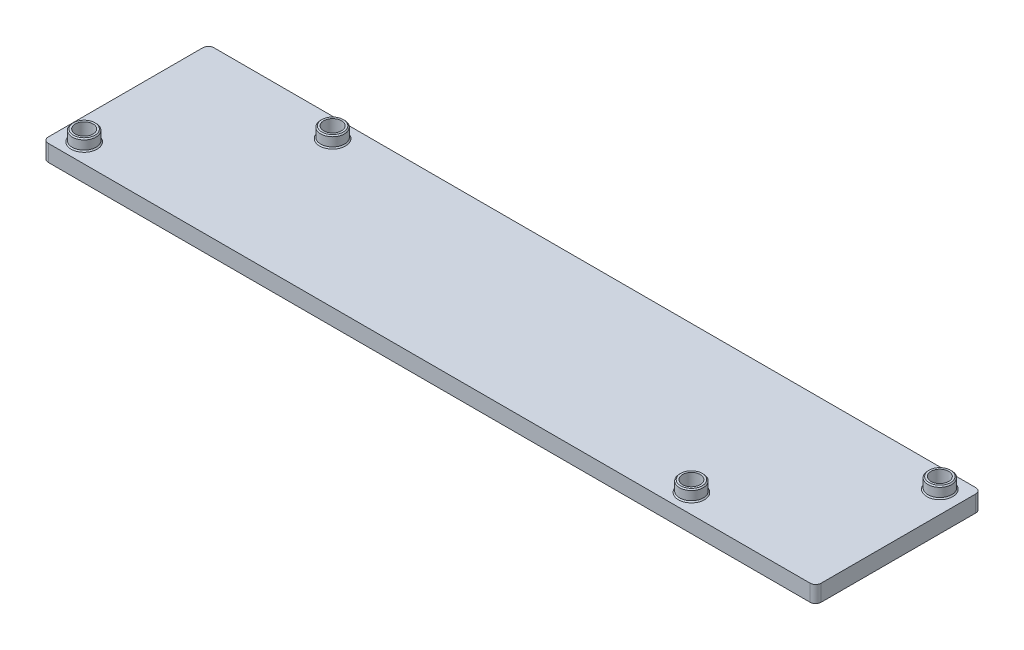
ISO-10303-21;
HEADER;
FILE_DESCRIPTION(('STEP AP214'),'2;1');
FILE_NAME('part.step','',(''),(''),'','','');
FILE_SCHEMA(('AUTOMOTIVE_DESIGN { 1 0 10303 214 1 1 1 1 }'));
ENDSEC;
DATA;
#1=APPLICATION_CONTEXT('core data for automotive mechanical design processes');
#2=APPLICATION_PROTOCOL_DEFINITION('international standard','automotive_design',2000,#1);
#3=PRODUCT_CONTEXT('',#1,'mechanical');
#4=PRODUCT('Part','Part','',(#3));
#5=PRODUCT_RELATED_PRODUCT_CATEGORY('part','',(#4));
#6=PRODUCT_DEFINITION_FORMATION('','',#4);
#7=PRODUCT_DEFINITION_CONTEXT('part definition',#1,'design');
#8=PRODUCT_DEFINITION('design','',#6,#7);
#9=PRODUCT_DEFINITION_SHAPE('','',#8);
#10=(LENGTH_UNIT() NAMED_UNIT(*) SI_UNIT(.MILLI.,.METRE.));
#11=(NAMED_UNIT(*) PLANE_ANGLE_UNIT() SI_UNIT($,.RADIAN.));
#12=(NAMED_UNIT(*) SI_UNIT($,.STERADIAN.) SOLID_ANGLE_UNIT());
#13=UNCERTAINTY_MEASURE_WITH_UNIT(LENGTH_MEASURE(1.E-05),#10,'distance_accuracy_value','');
#14=(GEOMETRIC_REPRESENTATION_CONTEXT(3) GLOBAL_UNCERTAINTY_ASSIGNED_CONTEXT((#13)) GLOBAL_UNIT_ASSIGNED_CONTEXT((#10,
#11,#12)) REPRESENTATION_CONTEXT('',''));
#15=CARTESIAN_POINT('',(0.,0.,0.));
#16=DIRECTION('',(0.,0.,1.));
#17=DIRECTION('',(1.,0.,0.));
#18=AXIS2_PLACEMENT_3D('',#15,#16,#17);
#19=CARTESIAN_POINT('',(0.,3.,0.));
#20=DIRECTION('',(0.,1.,0.));
#21=DIRECTION('',(0.,0.,1.));
#22=AXIS2_PLACEMENT_3D('',#19,#20,#21);
#23=PLANE('',#22);
#24=CARTESIAN_POINT('',(136.,3.,-26.5));
#25=DIRECTION('',(0.,1.,0.));
#26=DIRECTION('',(0.,0.,1.));
#27=AXIS2_PLACEMENT_3D('',#24,#25,#26);
#28=CIRCLE('',#27,2.34999999999999);
#29=CARTESIAN_POINT('',(136.,3.,-24.15));
#30=VERTEX_POINT('',#29);
#31=EDGE_CURVE('E153',#30,#30,#28,.F.);
#32=ORIENTED_EDGE('',*,*,#31,.T.);
#33=EDGE_LOOP('',(#32));
#34=FACE_BOUND('',#33,.T.);
#35=CARTESIAN_POINT('',(114.,3.,-3.50000000000001));
#36=DIRECTION('',(0.,1.,0.));
#37=DIRECTION('',(0.,0.,1.));
#38=AXIS2_PLACEMENT_3D('',#35,#36,#37);
#39=CIRCLE('',#38,2.34999999999999);
#40=CARTESIAN_POINT('',(114.,3.,-5.85));
#41=VERTEX_POINT('',#40);
#42=EDGE_CURVE('E150',#41,#41,#39,.F.);
#43=ORIENTED_EDGE('',*,*,#42,.T.);
#44=EDGE_LOOP('',(#43));
#45=FACE_BOUND('',#44,.T.);
#46=CARTESIAN_POINT('',(26.,3.,-26.5));
#47=DIRECTION('',(0.,1.,0.));
#48=DIRECTION('',(0.,0.,1.));
#49=AXIS2_PLACEMENT_3D('',#46,#47,#48);
#50=CIRCLE('',#49,2.34999999999999);
#51=CARTESIAN_POINT('',(26.,3.,-24.15));
#52=VERTEX_POINT('',#51);
#53=EDGE_CURVE('E147',#52,#52,#50,.F.);
#54=ORIENTED_EDGE('',*,*,#53,.T.);
#55=EDGE_LOOP('',(#54));
#56=FACE_BOUND('',#55,.T.);
#57=CARTESIAN_POINT('',(4.,3.,-3.5));
#58=DIRECTION('',(0.,1.,0.));
#59=DIRECTION('',(0.,0.,1.));
#60=AXIS2_PLACEMENT_3D('',#57,#58,#59);
#61=CIRCLE('',#60,2.34999999999999);
#62=CARTESIAN_POINT('',(4.,3.,-1.15000000000001));
#63=VERTEX_POINT('',#62);
#64=EDGE_CURVE('E144',#63,#63,#61,.F.);
#65=ORIENTED_EDGE('',*,*,#64,.T.);
#66=EDGE_LOOP('',(#65));
#67=FACE_BOUND('',#66,.T.);
#68=DIRECTION('',(0.,0.,1.));
#69=VECTOR('',#68,1.);
#70=CARTESIAN_POINT('',(0.,3.,-30.));
#71=LINE('',#70,#69);
#72=CARTESIAN_POINT('',(0.,3.,-29.));
#73=VERTEX_POINT('',#72);
#74=CARTESIAN_POINT('',(0.,3.,-1.));
#75=VERTEX_POINT('',#74);
#76=EDGE_CURVE('E136',#73,#75,#71,.T.);
#77=ORIENTED_EDGE('',*,*,#76,.T.);
#78=CARTESIAN_POINT('',(1.,3.,-1.));
#79=DIRECTION('',(0.,1.,0.));
#80=DIRECTION('',(0.,0.,1.));
#81=AXIS2_PLACEMENT_3D('',#78,#79,#80);
#82=CIRCLE('',#81,1.);
#83=CARTESIAN_POINT('',(1.,3.,0.));
#84=VERTEX_POINT('',#83);
#85=EDGE_CURVE('E223',#75,#84,#82,.T.);
#86=ORIENTED_EDGE('',*,*,#85,.T.);
#87=DIRECTION('',(1.,0.,0.));
#88=VECTOR('',#87,1.);
#89=CARTESIAN_POINT('',(0.,3.,0.));
#90=LINE('',#89,#88);
#91=CARTESIAN_POINT('',(139.,3.,0.));
#92=VERTEX_POINT('',#91);
#93=EDGE_CURVE('E119',#84,#92,#90,.T.);
#94=ORIENTED_EDGE('',*,*,#93,.T.);
#95=CARTESIAN_POINT('',(139.,3.,-1.));
#96=DIRECTION('',(0.,1.,0.));
#97=DIRECTION('',(0.,0.,1.));
#98=AXIS2_PLACEMENT_3D('',#95,#96,#97);
#99=CIRCLE('',#98,1.);
#100=CARTESIAN_POINT('',(140.,3.,-1.));
#101=VERTEX_POINT('',#100);
#102=EDGE_CURVE('E218',#92,#101,#99,.T.);
#103=ORIENTED_EDGE('',*,*,#102,.T.);
#104=DIRECTION('',(0.,0.,-1.));
#105=VECTOR('',#104,1.);
#106=CARTESIAN_POINT('',(140.,3.,-30.));
#107=LINE('',#106,#105);
#108=CARTESIAN_POINT('',(140.,3.,-29.));
#109=VERTEX_POINT('',#108);
#110=EDGE_CURVE('E234',#101,#109,#107,.T.);
#111=ORIENTED_EDGE('',*,*,#110,.T.);
#112=CARTESIAN_POINT('',(139.,3.,-29.));
#113=DIRECTION('',(0.,1.,0.));
#114=DIRECTION('',(0.,0.,1.));
#115=AXIS2_PLACEMENT_3D('',#112,#113,#114);
#116=CIRCLE('',#115,1.);
#117=CARTESIAN_POINT('',(139.,3.,-30.));
#118=VERTEX_POINT('',#117);
#119=EDGE_CURVE('E55',#109,#118,#116,.T.);
#120=ORIENTED_EDGE('',*,*,#119,.T.);
#121=DIRECTION('',(-1.,0.,0.));
#122=VECTOR('',#121,1.);
#123=CARTESIAN_POINT('',(0.,3.,-30.));
#124=LINE('',#123,#122);
#125=CARTESIAN_POINT('',(1.,3.,-30.));
#126=VERTEX_POINT('',#125);
#127=EDGE_CURVE('E141',#118,#126,#124,.T.);
#128=ORIENTED_EDGE('',*,*,#127,.T.);
#129=CARTESIAN_POINT('',(1.,3.,-29.));
#130=DIRECTION('',(0.,1.,0.));
#131=DIRECTION('',(0.,0.,1.));
#132=AXIS2_PLACEMENT_3D('',#129,#130,#131);
#133=CIRCLE('',#132,1.);
#134=EDGE_CURVE('E221',#126,#73,#133,.T.);
#135=ORIENTED_EDGE('',*,*,#134,.T.);
#136=EDGE_LOOP('',(#77,#86,#94,#103,#111,#120,#128,#135));
#137=FACE_BOUND('',#136,.T.);
#138=ADVANCED_FACE('F33',(#34,#45,#56,#67,#137),#23,.T.);
#139=CARTESIAN_POINT('',(0.,0.,0.));
#140=DIRECTION('',(0.,1.,0.));
#141=DIRECTION('',(0.,0.,1.));
#142=AXIS2_PLACEMENT_3D('',#139,#140,#141);
#143=PLANE('',#142);
#144=CARTESIAN_POINT('',(136.,0.,-26.5));
#145=DIRECTION('',(0.,1.,0.));
#146=DIRECTION('',(0.,0.,1.));
#147=AXIS2_PLACEMENT_3D('',#144,#145,#146);
#148=CIRCLE('',#147,3.09999999999998);
#149=CARTESIAN_POINT('',(136.,0.,-23.4));
#150=VERTEX_POINT('',#149);
#151=EDGE_CURVE('E195',#150,#150,#148,.T.);
#152=ORIENTED_EDGE('',*,*,#151,.T.);
#153=EDGE_LOOP('',(#152));
#154=FACE_BOUND('',#153,.T.);
#155=CARTESIAN_POINT('',(114.,0.,-3.50000000000001));
#156=DIRECTION('',(0.,1.,0.));
#157=DIRECTION('',(0.,0.,1.));
#158=AXIS2_PLACEMENT_3D('',#155,#156,#157);
#159=CIRCLE('',#158,3.10000000000003);
#160=CARTESIAN_POINT('',(114.,0.,-0.399999999999974));
#161=VERTEX_POINT('',#160);
#162=EDGE_CURVE('E192',#161,#161,#159,.T.);
#163=ORIENTED_EDGE('',*,*,#162,.T.);
#164=EDGE_LOOP('',(#163));
#165=FACE_BOUND('',#164,.T.);
#166=CARTESIAN_POINT('',(26.,0.,-26.5));
#167=DIRECTION('',(0.,1.,0.));
#168=DIRECTION('',(0.,0.,1.));
#169=AXIS2_PLACEMENT_3D('',#166,#167,#168);
#170=CIRCLE('',#169,3.10000000000002);
#171=CARTESIAN_POINT('',(26.,0.,-23.4));
#172=VERTEX_POINT('',#171);
#173=EDGE_CURVE('E189',#172,#172,#170,.T.);
#174=ORIENTED_EDGE('',*,*,#173,.T.);
#175=EDGE_LOOP('',(#174));
#176=FACE_BOUND('',#175,.T.);
#177=CARTESIAN_POINT('',(4.,0.,-3.5));
#178=DIRECTION('',(0.,1.,0.));
#179=DIRECTION('',(0.,0.,1.));
#180=AXIS2_PLACEMENT_3D('',#177,#178,#179);
#181=CIRCLE('',#180,3.09999999999999);
#182=CARTESIAN_POINT('',(4.,0.,-0.400000000000008));
#183=VERTEX_POINT('',#182);
#184=EDGE_CURVE('E186',#183,#183,#181,.T.);
#185=ORIENTED_EDGE('',*,*,#184,.T.);
#186=EDGE_LOOP('',(#185));
#187=FACE_BOUND('',#186,.T.);
#188=DIRECTION('',(1.,0.,0.));
#189=VECTOR('',#188,1.);
#190=CARTESIAN_POINT('',(0.,0.,0.));
#191=LINE('',#190,#189);
#192=CARTESIAN_POINT('',(1.,0.,0.));
#193=VERTEX_POINT('',#192);
#194=CARTESIAN_POINT('',(139.,0.,0.));
#195=VERTEX_POINT('',#194);
#196=EDGE_CURVE('E116',#193,#195,#191,.T.);
#197=ORIENTED_EDGE('',*,*,#196,.F.);
#198=CARTESIAN_POINT('',(1.,0.,-1.));
#199=DIRECTION('',(0.,1.,0.));
#200=DIRECTION('',(0.,0.,1.));
#201=AXIS2_PLACEMENT_3D('',#198,#199,#200);
#202=CIRCLE('',#201,1.);
#203=CARTESIAN_POINT('',(0.,0.,-1.));
#204=VERTEX_POINT('',#203);
#205=EDGE_CURVE('E99',#193,#204,#202,.F.);
#206=ORIENTED_EDGE('',*,*,#205,.T.);
#207=DIRECTION('',(0.,0.,1.));
#208=VECTOR('',#207,1.);
#209=CARTESIAN_POINT('',(0.,0.,-30.));
#210=LINE('',#209,#208);
#211=CARTESIAN_POINT('',(0.,0.,-29.));
#212=VERTEX_POINT('',#211);
#213=EDGE_CURVE('E126',#212,#204,#210,.T.);
#214=ORIENTED_EDGE('',*,*,#213,.F.);
#215=CARTESIAN_POINT('',(1.,0.,-29.));
#216=DIRECTION('',(0.,1.,0.));
#217=DIRECTION('',(0.,0.,1.));
#218=AXIS2_PLACEMENT_3D('',#215,#216,#217);
#219=CIRCLE('',#218,1.);
#220=CARTESIAN_POINT('',(1.,0.,-30.));
#221=VERTEX_POINT('',#220);
#222=EDGE_CURVE('E110',#212,#221,#219,.F.);
#223=ORIENTED_EDGE('',*,*,#222,.T.);
#224=DIRECTION('',(-1.,0.,0.));
#225=VECTOR('',#224,1.);
#226=CARTESIAN_POINT('',(0.,0.,-30.));
#227=LINE('',#226,#225);
#228=CARTESIAN_POINT('',(139.,0.,-30.));
#229=VERTEX_POINT('',#228);
#230=EDGE_CURVE('E129',#229,#221,#227,.T.);
#231=ORIENTED_EDGE('',*,*,#230,.F.);
#232=CARTESIAN_POINT('',(139.,0.,-29.));
#233=DIRECTION('',(0.,1.,0.));
#234=DIRECTION('',(0.,0.,1.));
#235=AXIS2_PLACEMENT_3D('',#232,#233,#234);
#236=CIRCLE('',#235,1.);
#237=CARTESIAN_POINT('',(140.,0.,-29.));
#238=VERTEX_POINT('',#237);
#239=EDGE_CURVE('E212',#229,#238,#236,.F.);
#240=ORIENTED_EDGE('',*,*,#239,.T.);
#241=DIRECTION('',(0.,0.,-1.));
#242=VECTOR('',#241,1.);
#243=CARTESIAN_POINT('',(140.,0.,-30.));
#244=LINE('',#243,#242);
#245=CARTESIAN_POINT('',(140.,0.,-1.));
#246=VERTEX_POINT('',#245);
#247=EDGE_CURVE('E125',#246,#238,#244,.T.);
#248=ORIENTED_EDGE('',*,*,#247,.F.);
#249=CARTESIAN_POINT('',(139.,0.,-1.));
#250=DIRECTION('',(0.,1.,0.));
#251=DIRECTION('',(0.,0.,1.));
#252=AXIS2_PLACEMENT_3D('',#249,#250,#251);
#253=CIRCLE('',#252,1.);
#254=EDGE_CURVE('E120',#246,#195,#253,.F.);
#255=ORIENTED_EDGE('',*,*,#254,.T.);
#256=EDGE_LOOP('',(#197,#206,#214,#223,#231,#240,#248,#255));
#257=FACE_BOUND('',#256,.T.);
#258=ADVANCED_FACE('F123',(#154,#165,#176,#187,#257),#143,.F.);
#259=CARTESIAN_POINT('',(0.,3.,-30.));
#260=DIRECTION('',(1.,0.,0.));
#261=DIRECTION('',(0.,0.,-1.));
#262=AXIS2_PLACEMENT_3D('',#259,#260,#261);
#263=PLANE('',#262);
#264=ORIENTED_EDGE('',*,*,#213,.T.);
#265=DIRECTION('',(0.,-1.,0.));
#266=VECTOR('',#265,1.);
#267=CARTESIAN_POINT('',(0.,3.,-1.));
#268=LINE('',#267,#266);
#269=EDGE_CURVE('E104',#204,#75,#268,.F.);
#270=ORIENTED_EDGE('',*,*,#269,.T.);
#271=ORIENTED_EDGE('',*,*,#76,.F.);
#272=DIRECTION('',(0.,-1.,0.));
#273=VECTOR('',#272,1.);
#274=CARTESIAN_POINT('',(0.,3.,-29.));
#275=LINE('',#274,#273);
#276=EDGE_CURVE('E109',#73,#212,#275,.T.);
#277=ORIENTED_EDGE('',*,*,#276,.T.);
#278=EDGE_LOOP('',(#264,#270,#271,#277));
#279=FACE_BOUND('',#278,.T.);
#280=ADVANCED_FACE('F284',(#279),#263,.F.);
#281=CARTESIAN_POINT('',(0.,3.,0.));
#282=DIRECTION('',(0.,0.,-1.));
#283=DIRECTION('',(-1.,0.,0.));
#284=AXIS2_PLACEMENT_3D('',#281,#282,#283);
#285=PLANE('',#284);
#286=ORIENTED_EDGE('',*,*,#93,.F.);
#287=DIRECTION('',(0.,-1.,0.));
#288=VECTOR('',#287,1.);
#289=CARTESIAN_POINT('',(1.,3.,0.));
#290=LINE('',#289,#288);
#291=EDGE_CURVE('E103',#84,#193,#290,.T.);
#292=ORIENTED_EDGE('',*,*,#291,.T.);
#293=ORIENTED_EDGE('',*,*,#196,.T.);
#294=DIRECTION('',(0.,-1.,0.));
#295=VECTOR('',#294,1.);
#296=CARTESIAN_POINT('',(139.,3.,0.));
#297=LINE('',#296,#295);
#298=EDGE_CURVE('E121',#195,#92,#297,.F.);
#299=ORIENTED_EDGE('',*,*,#298,.T.);
#300=EDGE_LOOP('',(#286,#292,#293,#299));
#301=FACE_BOUND('',#300,.T.);
#302=ADVANCED_FACE('F115',(#301),#285,.F.);
#303=CARTESIAN_POINT('',(140.,3.,-30.));
#304=DIRECTION('',(-1.,0.,0.));
#305=DIRECTION('',(0.,0.,1.));
#306=AXIS2_PLACEMENT_3D('',#303,#304,#305);
#307=PLANE('',#306);
#308=ORIENTED_EDGE('',*,*,#247,.T.);
#309=DIRECTION('',(0.,-1.,0.));
#310=VECTOR('',#309,1.);
#311=CARTESIAN_POINT('',(140.,3.,-29.));
#312=LINE('',#311,#310);
#313=EDGE_CURVE('E11',#238,#109,#312,.F.);
#314=ORIENTED_EDGE('',*,*,#313,.T.);
#315=ORIENTED_EDGE('',*,*,#110,.F.);
#316=DIRECTION('',(0.,-1.,0.));
#317=VECTOR('',#316,1.);
#318=CARTESIAN_POINT('',(140.,3.,-1.));
#319=LINE('',#318,#317);
#320=EDGE_CURVE('E41',#101,#246,#319,.T.);
#321=ORIENTED_EDGE('',*,*,#320,.T.);
#322=EDGE_LOOP('',(#308,#314,#315,#321));
#323=FACE_BOUND('',#322,.T.);
#324=ADVANCED_FACE('F232',(#323),#307,.F.);
#325=CARTESIAN_POINT('',(0.,3.,-30.));
#326=DIRECTION('',(0.,0.,1.));
#327=DIRECTION('',(1.,0.,0.));
#328=AXIS2_PLACEMENT_3D('',#325,#326,#327);
#329=PLANE('',#328);
#330=ORIENTED_EDGE('',*,*,#230,.T.);
#331=DIRECTION('',(0.,-1.,0.));
#332=VECTOR('',#331,1.);
#333=CARTESIAN_POINT('',(1.,3.,-30.));
#334=LINE('',#333,#332);
#335=EDGE_CURVE('E48',#221,#126,#334,.F.);
#336=ORIENTED_EDGE('',*,*,#335,.T.);
#337=ORIENTED_EDGE('',*,*,#127,.F.);
#338=DIRECTION('',(0.,-1.,0.));
#339=VECTOR('',#338,1.);
#340=CARTESIAN_POINT('',(139.,3.,-30.));
#341=LINE('',#340,#339);
#342=EDGE_CURVE('E225',#118,#229,#341,.T.);
#343=ORIENTED_EDGE('',*,*,#342,.T.);
#344=EDGE_LOOP('',(#330,#336,#337,#343));
#345=FACE_BOUND('',#344,.T.);
#346=ADVANCED_FACE('F241',(#345),#329,.F.);
#347=CARTESIAN_POINT('',(4.,3.,-3.5));
#348=DIRECTION('',(0.,-1.,0.));
#349=DIRECTION('',(0.,0.,-1.));
#350=AXIS2_PLACEMENT_3D('',#347,#348,#349);
#351=CYLINDRICAL_SURFACE('',#350,1.6);
#352=CARTESIAN_POINT('',(4.,1.5,-3.5));
#353=DIRECTION('',(0.,1.,0.));
#354=DIRECTION('',(0.,0.,1.));
#355=AXIS2_PLACEMENT_3D('',#352,#353,#354);
#356=CIRCLE('',#355,1.6);
#357=CARTESIAN_POINT('',(4.,1.5,-1.9));
#358=VERTEX_POINT('',#357);
#359=EDGE_CURVE('E207',#358,#358,#356,.F.);
#360=ORIENTED_EDGE('',*,*,#359,.T.);
#361=EDGE_LOOP('',(#360));
#362=FACE_BOUND('',#361,.T.);
#363=CARTESIAN_POINT('',(4.,5.,-3.5));
#364=DIRECTION('',(0.,1.,0.));
#365=DIRECTION('',(0.,0.,1.));
#366=AXIS2_PLACEMENT_3D('',#363,#364,#365);
#367=CIRCLE('',#366,1.6);
#368=CARTESIAN_POINT('',(4.,5.,-1.9));
#369=VERTEX_POINT('',#368);
#370=EDGE_CURVE('E131',#369,#369,#367,.T.);
#371=ORIENTED_EDGE('',*,*,#370,.T.);
#372=EDGE_LOOP('',(#371));
#373=FACE_BOUND('',#372,.T.);
#374=ADVANCED_FACE('F289',(#362,#373),#351,.F.);
#375=CARTESIAN_POINT('',(26.,3.,-26.5));
#376=DIRECTION('',(0.,-1.,0.));
#377=DIRECTION('',(0.,0.,-1.));
#378=AXIS2_PLACEMENT_3D('',#375,#376,#377);
#379=CYLINDRICAL_SURFACE('',#378,1.6);
#380=CARTESIAN_POINT('',(26.,1.50000000000004,-26.5));
#381=DIRECTION('',(0.,1.,0.));
#382=DIRECTION('',(0.,0.,1.));
#383=AXIS2_PLACEMENT_3D('',#380,#381,#382);
#384=CIRCLE('',#383,1.6);
#385=CARTESIAN_POINT('',(26.,1.50000000000004,-24.9));
#386=VERTEX_POINT('',#385);
#387=EDGE_CURVE('E204',#386,#386,#384,.F.);
#388=ORIENTED_EDGE('',*,*,#387,.T.);
#389=EDGE_LOOP('',(#388));
#390=FACE_BOUND('',#389,.T.);
#391=CARTESIAN_POINT('',(26.,5.,-26.5));
#392=DIRECTION('',(0.,1.,0.));
#393=DIRECTION('',(0.,0.,1.));
#394=AXIS2_PLACEMENT_3D('',#391,#392,#393);
#395=CIRCLE('',#394,1.6);
#396=CARTESIAN_POINT('',(26.,5.,-24.9));
#397=VERTEX_POINT('',#396);
#398=EDGE_CURVE('E250',#397,#397,#395,.T.);
#399=ORIENTED_EDGE('',*,*,#398,.T.);
#400=EDGE_LOOP('',(#399));
#401=FACE_BOUND('',#400,.T.);
#402=ADVANCED_FACE('F462',(#390,#401),#379,.F.);
#403=CARTESIAN_POINT('',(114.,3.,-3.50000000000001));
#404=DIRECTION('',(0.,-1.,0.));
#405=DIRECTION('',(0.,0.,-1.));
#406=AXIS2_PLACEMENT_3D('',#403,#404,#405);
#407=CYLINDRICAL_SURFACE('',#406,1.60000000000001);
#408=CARTESIAN_POINT('',(114.,1.50000000000002,-3.50000000000001));
#409=DIRECTION('',(0.,1.,0.));
#410=DIRECTION('',(0.,0.,1.));
#411=AXIS2_PLACEMENT_3D('',#408,#409,#410);
#412=CIRCLE('',#411,1.60000000000001);
#413=CARTESIAN_POINT('',(114.,1.50000000000002,-1.9));
#414=VERTEX_POINT('',#413);
#415=EDGE_CURVE('E201',#414,#414,#412,.F.);
#416=ORIENTED_EDGE('',*,*,#415,.T.);
#417=EDGE_LOOP('',(#416));
#418=FACE_BOUND('',#417,.T.);
#419=CARTESIAN_POINT('',(114.,5.,-3.50000000000001));
#420=DIRECTION('',(0.,1.,0.));
#421=DIRECTION('',(0.,0.,1.));
#422=AXIS2_PLACEMENT_3D('',#419,#420,#421);
#423=CIRCLE('',#422,1.60000000000001);
#424=CARTESIAN_POINT('',(114.,5.,-1.9));
#425=VERTEX_POINT('',#424);
#426=EDGE_CURVE('E253',#425,#425,#423,.T.);
#427=ORIENTED_EDGE('',*,*,#426,.T.);
#428=EDGE_LOOP('',(#427));
#429=FACE_BOUND('',#428,.T.);
#430=ADVANCED_FACE('F450',(#418,#429),#407,.F.);
#431=CARTESIAN_POINT('',(136.,3.,-26.5));
#432=DIRECTION('',(0.,-1.,0.));
#433=DIRECTION('',(0.,0.,-1.));
#434=AXIS2_PLACEMENT_3D('',#431,#432,#433);
#435=CYLINDRICAL_SURFACE('',#434,1.59999999999999);
#436=CARTESIAN_POINT('',(136.,1.50000000000001,-26.5));
#437=DIRECTION('',(0.,1.,0.));
#438=DIRECTION('',(0.,0.,1.));
#439=AXIS2_PLACEMENT_3D('',#436,#437,#438);
#440=CIRCLE('',#439,1.59999999999999);
#441=CARTESIAN_POINT('',(136.,1.50000000000001,-24.9));
#442=VERTEX_POINT('',#441);
#443=EDGE_CURVE('E198',#442,#442,#440,.F.);
#444=ORIENTED_EDGE('',*,*,#443,.T.);
#445=EDGE_LOOP('',(#444));
#446=FACE_BOUND('',#445,.T.);
#447=CARTESIAN_POINT('',(136.,5.,-26.5));
#448=DIRECTION('',(0.,1.,0.));
#449=DIRECTION('',(0.,0.,1.));
#450=AXIS2_PLACEMENT_3D('',#447,#448,#449);
#451=CIRCLE('',#450,1.59999999999999);
#452=CARTESIAN_POINT('',(136.,5.,-24.9));
#453=VERTEX_POINT('',#452);
#454=EDGE_CURVE('E256',#453,#453,#451,.T.);
#455=ORIENTED_EDGE('',*,*,#454,.T.);
#456=EDGE_LOOP('',(#455));
#457=FACE_BOUND('',#456,.T.);
#458=ADVANCED_FACE('F260',(#446,#457),#435,.F.);
#459=CARTESIAN_POINT('',(4.,5.,-3.5));
#460=DIRECTION('',(0.,1.,0.));
#461=DIRECTION('',(0.,0.,1.));
#462=AXIS2_PLACEMENT_3D('',#459,#460,#461);
#463=PLANE('',#462);
#464=CARTESIAN_POINT('',(4.,5.,-3.5));
#465=DIRECTION('',(0.,1.,0.));
#466=DIRECTION('',(0.,0.,1.));
#467=AXIS2_PLACEMENT_3D('',#464,#465,#466);
#468=CIRCLE('',#467,1.95000000000001);
#469=CARTESIAN_POINT('',(4.,5.,-1.54999999999999));
#470=VERTEX_POINT('',#469);
#471=EDGE_CURVE('E183',#470,#470,#468,.T.);
#472=ORIENTED_EDGE('',*,*,#471,.T.);
#473=EDGE_LOOP('',(#472));
#474=FACE_BOUND('',#473,.T.);
#475=ORIENTED_EDGE('',*,*,#370,.F.);
#476=EDGE_LOOP('',(#475));
#477=FACE_BOUND('',#476,.T.);
#478=ADVANCED_FACE('F449',(#474,#477),#463,.T.);
#479=CARTESIAN_POINT('',(4.,5.,-3.5));
#480=DIRECTION('',(0.,-1.,0.));
#481=DIRECTION('',(0.,0.,-1.));
#482=AXIS2_PLACEMENT_3D('',#479,#480,#481);
#483=CYLINDRICAL_SURFACE('',#482,2.15);
#484=CARTESIAN_POINT('',(4.,3.20000000000001,-3.5));
#485=DIRECTION('',(0.,1.,0.));
#486=DIRECTION('',(0.,0.,1.));
#487=AXIS2_PLACEMENT_3D('',#484,#485,#486);
#488=CIRCLE('',#487,2.15);
#489=CARTESIAN_POINT('',(4.,3.20000000000001,-1.35));
#490=VERTEX_POINT('',#489);
#491=EDGE_CURVE('E180',#490,#490,#488,.T.);
#492=ORIENTED_EDGE('',*,*,#491,.T.);
#493=EDGE_LOOP('',(#492));
#494=FACE_BOUND('',#493,.T.);
#495=CARTESIAN_POINT('',(4.,4.80000000000001,-3.5));
#496=DIRECTION('',(0.,1.,0.));
#497=DIRECTION('',(0.,0.,1.));
#498=AXIS2_PLACEMENT_3D('',#495,#496,#497);
#499=CIRCLE('',#498,2.15);
#500=CARTESIAN_POINT('',(4.,4.80000000000001,-1.35));
#501=VERTEX_POINT('',#500);
#502=EDGE_CURVE('E177',#501,#501,#499,.F.);
#503=ORIENTED_EDGE('',*,*,#502,.T.);
#504=EDGE_LOOP('',(#503));
#505=FACE_BOUND('',#504,.T.);
#506=ADVANCED_FACE('F571',(#494,#505),#483,.T.);
#507=CARTESIAN_POINT('',(26.,5.,-26.5));
#508=DIRECTION('',(0.,1.,0.));
#509=DIRECTION('',(0.,0.,1.));
#510=AXIS2_PLACEMENT_3D('',#507,#508,#509);
#511=PLANE('',#510);
#512=CARTESIAN_POINT('',(26.,5.,-26.5));
#513=DIRECTION('',(0.,1.,0.));
#514=DIRECTION('',(0.,0.,1.));
#515=AXIS2_PLACEMENT_3D('',#512,#513,#514);
#516=CIRCLE('',#515,1.94999999999999);
#517=CARTESIAN_POINT('',(26.,5.,-28.45));
#518=VERTEX_POINT('',#517);
#519=EDGE_CURVE('E174',#518,#518,#516,.T.);
#520=ORIENTED_EDGE('',*,*,#519,.T.);
#521=EDGE_LOOP('',(#520));
#522=FACE_BOUND('',#521,.T.);
#523=ORIENTED_EDGE('',*,*,#398,.F.);
#524=EDGE_LOOP('',(#523));
#525=FACE_BOUND('',#524,.T.);
#526=ADVANCED_FACE('F561',(#522,#525),#511,.T.);
#527=CARTESIAN_POINT('',(26.,5.,-26.5));
#528=DIRECTION('',(0.,-1.,0.));
#529=DIRECTION('',(0.,0.,-1.));
#530=AXIS2_PLACEMENT_3D('',#527,#528,#529);
#531=CYLINDRICAL_SURFACE('',#530,2.15);
#532=CARTESIAN_POINT('',(26.,3.20000000000001,-26.5));
#533=DIRECTION('',(0.,1.,0.));
#534=DIRECTION('',(0.,0.,1.));
#535=AXIS2_PLACEMENT_3D('',#532,#533,#534);
#536=CIRCLE('',#535,2.15);
#537=CARTESIAN_POINT('',(26.,3.20000000000001,-24.35));
#538=VERTEX_POINT('',#537);
#539=EDGE_CURVE('E171',#538,#538,#536,.T.);
#540=ORIENTED_EDGE('',*,*,#539,.T.);
#541=EDGE_LOOP('',(#540));
#542=FACE_BOUND('',#541,.T.);
#543=CARTESIAN_POINT('',(26.,4.80000000000002,-26.5));
#544=DIRECTION('',(0.,1.,0.));
#545=DIRECTION('',(0.,0.,1.));
#546=AXIS2_PLACEMENT_3D('',#543,#544,#545);
#547=CIRCLE('',#546,2.15);
#548=CARTESIAN_POINT('',(26.,4.80000000000002,-28.65));
#549=VERTEX_POINT('',#548);
#550=EDGE_CURVE('E168',#549,#549,#547,.F.);
#551=ORIENTED_EDGE('',*,*,#550,.T.);
#552=EDGE_LOOP('',(#551));
#553=FACE_BOUND('',#552,.T.);
#554=ADVANCED_FACE('F551',(#542,#553),#531,.T.);
#555=CARTESIAN_POINT('',(114.,5.,-3.50000000000001));
#556=DIRECTION('',(0.,1.,0.));
#557=DIRECTION('',(0.,0.,1.));
#558=AXIS2_PLACEMENT_3D('',#555,#556,#557);
#559=PLANE('',#558);
#560=CARTESIAN_POINT('',(114.,5.,-3.50000000000001));
#561=DIRECTION('',(0.,1.,0.));
#562=DIRECTION('',(0.,0.,1.));
#563=AXIS2_PLACEMENT_3D('',#560,#561,#562);
#564=CIRCLE('',#563,1.95000000000001);
#565=CARTESIAN_POINT('',(114.,5.,-1.55));
#566=VERTEX_POINT('',#565);
#567=EDGE_CURVE('E165',#566,#566,#564,.T.);
#568=ORIENTED_EDGE('',*,*,#567,.T.);
#569=EDGE_LOOP('',(#568));
#570=FACE_BOUND('',#569,.T.);
#571=ORIENTED_EDGE('',*,*,#426,.F.);
#572=EDGE_LOOP('',(#571));
#573=FACE_BOUND('',#572,.T.);
#574=ADVANCED_FACE('F275',(#570,#573),#559,.T.);
#575=CARTESIAN_POINT('',(114.,5.,-3.50000000000001));
#576=DIRECTION('',(0.,-1.,0.));
#577=DIRECTION('',(0.,0.,-1.));
#578=AXIS2_PLACEMENT_3D('',#575,#576,#577);
#579=CYLINDRICAL_SURFACE('',#578,2.15);
#580=CARTESIAN_POINT('',(114.,3.20000000000001,-3.50000000000001));
#581=DIRECTION('',(0.,1.,0.));
#582=DIRECTION('',(0.,0.,1.));
#583=AXIS2_PLACEMENT_3D('',#580,#581,#582);
#584=CIRCLE('',#583,2.15);
#585=CARTESIAN_POINT('',(114.,3.2,-5.65000000000001));
#586=VERTEX_POINT('',#585);
#587=EDGE_CURVE('E162',#586,#586,#584,.T.);
#588=ORIENTED_EDGE('',*,*,#587,.T.);
#589=EDGE_LOOP('',(#588));
#590=FACE_BOUND('',#589,.T.);
#591=CARTESIAN_POINT('',(114.,4.80000000000001,-3.50000000000001));
#592=DIRECTION('',(0.,1.,0.));
#593=DIRECTION('',(0.,0.,1.));
#594=AXIS2_PLACEMENT_3D('',#591,#592,#593);
#595=CIRCLE('',#594,2.15);
#596=CARTESIAN_POINT('',(114.,4.80000000000001,-1.35000000000001));
#597=VERTEX_POINT('',#596);
#598=EDGE_CURVE('E159',#597,#597,#595,.F.);
#599=ORIENTED_EDGE('',*,*,#598,.T.);
#600=EDGE_LOOP('',(#599));
#601=FACE_BOUND('',#600,.T.);
#602=ADVANCED_FACE('F265',(#590,#601),#579,.T.);
#603=CARTESIAN_POINT('',(136.,5.,-26.5));
#604=DIRECTION('',(0.,1.,0.));
#605=DIRECTION('',(0.,0.,1.));
#606=AXIS2_PLACEMENT_3D('',#603,#604,#605);
#607=PLANE('',#606);
#608=CARTESIAN_POINT('',(136.,5.,-26.5));
#609=DIRECTION('',(0.,1.,0.));
#610=DIRECTION('',(0.,0.,1.));
#611=AXIS2_PLACEMENT_3D('',#608,#609,#610);
#612=CIRCLE('',#611,1.94999999999999);
#613=CARTESIAN_POINT('',(136.,5.,-24.55));
#614=VERTEX_POINT('',#613);
#615=EDGE_CURVE('E156',#614,#614,#612,.T.);
#616=ORIENTED_EDGE('',*,*,#615,.T.);
#617=EDGE_LOOP('',(#616));
#618=FACE_BOUND('',#617,.T.);
#619=ORIENTED_EDGE('',*,*,#454,.F.);
#620=EDGE_LOOP('',(#619));
#621=FACE_BOUND('',#620,.T.);
#622=ADVANCED_FACE('F262',(#618,#621),#607,.T.);
#623=CARTESIAN_POINT('',(136.,5.,-26.5));
#624=DIRECTION('',(0.,-1.,0.));
#625=DIRECTION('',(0.,0.,-1.));
#626=AXIS2_PLACEMENT_3D('',#623,#624,#625);
#627=CYLINDRICAL_SURFACE('',#626,2.15000000000002);
#628=CARTESIAN_POINT('',(136.,3.19999999999999,-26.5));
#629=DIRECTION('',(0.,1.,0.));
#630=DIRECTION('',(0.,0.,1.));
#631=AXIS2_PLACEMENT_3D('',#628,#629,#630);
#632=CIRCLE('',#631,2.15000000000002);
#633=CARTESIAN_POINT('',(136.,3.19999999999999,-24.35));
#634=VERTEX_POINT('',#633);
#635=EDGE_CURVE('E140',#634,#634,#632,.T.);
#636=ORIENTED_EDGE('',*,*,#635,.T.);
#637=EDGE_LOOP('',(#636));
#638=FACE_BOUND('',#637,.T.);
#639=CARTESIAN_POINT('',(136.,4.8,-26.5));
#640=DIRECTION('',(0.,1.,0.));
#641=DIRECTION('',(0.,0.,1.));
#642=AXIS2_PLACEMENT_3D('',#639,#640,#641);
#643=CIRCLE('',#642,2.15000000000002);
#644=CARTESIAN_POINT('',(136.,4.8,-24.35));
#645=VERTEX_POINT('',#644);
#646=EDGE_CURVE('E137',#645,#645,#643,.F.);
#647=ORIENTED_EDGE('',*,*,#646,.T.);
#648=EDGE_LOOP('',(#647));
#649=FACE_BOUND('',#648,.T.);
#650=ADVANCED_FACE('F264',(#638,#649),#627,.T.);
#651=CARTESIAN_POINT('',(136.,3.19999999999999,-26.5));
#652=DIRECTION('',(0.,-1.,0.));
#653=DIRECTION('',(0.,0.,-1.));
#654=AXIS2_PLACEMENT_3D('',#651,#652,#653);
#655=CONICAL_SURFACE('',#654,2.15000000000002,0.785398163397409);
#656=ORIENTED_EDGE('',*,*,#31,.F.);
#657=EDGE_LOOP('',(#656));
#658=FACE_BOUND('',#657,.T.);
#659=ORIENTED_EDGE('',*,*,#635,.F.);
#660=EDGE_LOOP('',(#659));
#661=FACE_BOUND('',#660,.T.);
#662=ADVANCED_FACE('F272',(#658,#661),#655,.T.);
#663=CARTESIAN_POINT('',(136.,5.,-26.5));
#664=DIRECTION('',(0.,-1.,0.));
#665=DIRECTION('',(0.,0.,-1.));
#666=AXIS2_PLACEMENT_3D('',#663,#664,#665);
#667=CONICAL_SURFACE('',#666,1.94999999999999,0.785398163397501);
#668=ORIENTED_EDGE('',*,*,#646,.F.);
#669=EDGE_LOOP('',(#668));
#670=FACE_BOUND('',#669,.T.);
#671=ORIENTED_EDGE('',*,*,#615,.F.);
#672=EDGE_LOOP('',(#671));
#673=FACE_BOUND('',#672,.T.);
#674=ADVANCED_FACE('F303',(#670,#673),#667,.T.);
#675=CARTESIAN_POINT('',(114.,3.20000000000001,-3.50000000000001));
#676=DIRECTION('',(0.,-1.,0.));
#677=DIRECTION('',(0.,0.,-1.));
#678=AXIS2_PLACEMENT_3D('',#675,#676,#677);
#679=CONICAL_SURFACE('',#678,2.15,0.785398163397411);
#680=CARTESIAN_POINT('',(114.,3.,-5.85));
#681=CARTESIAN_POINT('',(114.,3.00208333333333,-5.84791666666667));
#682=CARTESIAN_POINT('',(114.,3.00416666666667,-5.84583333333333));
#683=CARTESIAN_POINT('',(114.,3.00833333333333,-5.84166666666667));
#684=CARTESIAN_POINT('',(114.,3.01041666666667,-5.83958333333333));
#685=CARTESIAN_POINT('',(114.,3.01458333333333,-5.83541666666667));
#686=CARTESIAN_POINT('',(114.,3.01666666666667,-5.83333333333333));
#687=CARTESIAN_POINT('',(114.,3.02083333333333,-5.82916666666667));
#688=CARTESIAN_POINT('',(114.,3.02291666666667,-5.82708333333333));
#689=CARTESIAN_POINT('',(114.,3.02708333333333,-5.82291666666667));
#690=CARTESIAN_POINT('',(114.,3.02916666666667,-5.82083333333333));
#691=CARTESIAN_POINT('',(114.,3.03333333333333,-5.81666666666667));
#692=CARTESIAN_POINT('',(114.,3.03541666666667,-5.81458333333333));
#693=CARTESIAN_POINT('',(114.,3.03958333333333,-5.81041666666667));
#694=CARTESIAN_POINT('',(114.,3.04166666666667,-5.80833333333333));
#695=CARTESIAN_POINT('',(114.,3.04583333333333,-5.80416666666667));
#696=CARTESIAN_POINT('',(114.,3.04791666666667,-5.80208333333333));
#697=CARTESIAN_POINT('',(114.,3.05208333333333,-5.79791666666667));
#698=CARTESIAN_POINT('',(114.,3.05416666666667,-5.79583333333334));
#699=CARTESIAN_POINT('',(114.,3.05833333333333,-5.79166666666667));
#700=CARTESIAN_POINT('',(114.,3.06041666666667,-5.78958333333333));
#701=CARTESIAN_POINT('',(114.,3.06458333333333,-5.78541666666667));
#702=CARTESIAN_POINT('',(114.,3.06666666666667,-5.78333333333333));
#703=CARTESIAN_POINT('',(114.,3.07083333333334,-5.77916666666667));
#704=CARTESIAN_POINT('',(114.,3.07291666666667,-5.77708333333334));
#705=CARTESIAN_POINT('',(114.,3.07708333333334,-5.77291666666667));
#706=CARTESIAN_POINT('',(114.,3.07916666666667,-5.77083333333334));
#707=CARTESIAN_POINT('',(114.,3.08333333333334,-5.76666666666667));
#708=CARTESIAN_POINT('',(114.,3.08541666666667,-5.76458333333334));
#709=CARTESIAN_POINT('',(114.,3.08958333333334,-5.76041666666667));
#710=CARTESIAN_POINT('',(114.,3.09166666666667,-5.75833333333334));
#711=CARTESIAN_POINT('',(114.,3.09583333333334,-5.75416666666667));
#712=CARTESIAN_POINT('',(114.,3.09791666666667,-5.75208333333334));
#713=CARTESIAN_POINT('',(114.,3.10208333333334,-5.74791666666667));
#714=CARTESIAN_POINT('',(114.,3.10416666666667,-5.74583333333334));
#715=CARTESIAN_POINT('',(114.,3.10833333333334,-5.74166666666667));
#716=CARTESIAN_POINT('',(114.,3.11041666666667,-5.73958333333334));
#717=CARTESIAN_POINT('',(114.,3.11458333333334,-5.73541666666667));
#718=CARTESIAN_POINT('',(114.,3.11666666666667,-5.73333333333334));
#719=CARTESIAN_POINT('',(114.,3.12083333333334,-5.72916666666667));
#720=CARTESIAN_POINT('',(114.,3.12291666666667,-5.72708333333334));
#721=CARTESIAN_POINT('',(114.,3.12708333333334,-5.72291666666667));
#722=CARTESIAN_POINT('',(114.,3.12916666666667,-5.72083333333334));
#723=CARTESIAN_POINT('',(114.,3.13333333333334,-5.71666666666667));
#724=CARTESIAN_POINT('',(114.,3.13541666666667,-5.71458333333334));
#725=CARTESIAN_POINT('',(114.,3.13958333333334,-5.71041666666667));
#726=CARTESIAN_POINT('',(114.,3.14166666666667,-5.70833333333334));
#727=CARTESIAN_POINT('',(114.,3.14583333333334,-5.70416666666667));
#728=CARTESIAN_POINT('',(114.,3.14791666666667,-5.70208333333334));
#729=CARTESIAN_POINT('',(114.,3.15208333333334,-5.69791666666667));
#730=CARTESIAN_POINT('',(114.,3.15416666666667,-5.69583333333334));
#731=CARTESIAN_POINT('',(114.,3.15833333333334,-5.69166666666667));
#732=CARTESIAN_POINT('',(114.,3.16041666666667,-5.68958333333334));
#733=CARTESIAN_POINT('',(114.,3.16458333333334,-5.68541666666667));
#734=CARTESIAN_POINT('',(114.,3.16666666666667,-5.68333333333334));
#735=CARTESIAN_POINT('',(114.,3.17083333333334,-5.67916666666667));
#736=CARTESIAN_POINT('',(114.,3.17291666666667,-5.67708333333334));
#737=CARTESIAN_POINT('',(114.,3.17708333333334,-5.67291666666667));
#738=CARTESIAN_POINT('',(114.,3.17916666666667,-5.67083333333334));
#739=CARTESIAN_POINT('',(114.,3.18333333333334,-5.66666666666667));
#740=CARTESIAN_POINT('',(114.,3.18541666666667,-5.66458333333334));
#741=CARTESIAN_POINT('',(114.,3.18958333333334,-5.66041666666667));
#742=CARTESIAN_POINT('',(114.,3.19166666666667,-5.65833333333334));
#743=CARTESIAN_POINT('',(114.,3.19583333333334,-5.65416666666668));
#744=CARTESIAN_POINT('',(114.,3.19791666666667,-5.65208333333334));
#745=CARTESIAN_POINT('',(114.,3.20000000000001,-5.65000000000001));
#746=B_SPLINE_CURVE_WITH_KNOTS('',3,(#680,#681,#682,#683,#684,#685,#686,#687,#688,#689,#690,
#691,#692,#693,#694,#695,#696,#697,#698,#699,#700,#701,#702,#703,#704,#705,#706,#707,#708,#709,
#710,#711,#712,#713,#714,#715,#716,#717,#718,#719,#720,#721,#722,#723,#724,#725,#726,#727,#728,
#729,#730,#731,#732,#733,#734,#735,#736,#737,#738,#739,#740,#741,#742,#743,#744,#745),
.UNSPECIFIED.,.F.,.F.,(4,2,2,2,2,2,2,2,2,2,2,2,2,2,2,2,2,2,2,2,2,2,2,2,2,2,2,2,2,2,2,2,4),(0.,
0.0088388347648321,0.0176776695296642,0.0265165042944957,0.0353553390593272,0.0441941738241593,
0.0530330085889914,0.0618718433538228,0.0707106781186543,0.0795495128834858,0.0883883476483179,
0.09722718241315,0.106066017177981,0.114904851942813,0.123743686707645,0.132582521472477,
0.141421356237308,0.15026019100214,0.159099025766971,0.167937860531803,0.176776695296635,
0.185615530061467,0.194454364826298,0.203293199591131,0.212132034355963,0.220970869120794,
0.229809703885626,0.238648538650457,0.247487373415289,0.256326208180121,0.265165042944953,
0.274003877709784,0.282842712474616),.UNSPECIFIED.);
#747=EDGE_CURVE('BSEAM307',#41,#586,#746,.T.);
#748=ORIENTED_EDGE('',*,*,#42,.F.);
#749=ORIENTED_EDGE('',*,*,#587,.F.);
#750=ORIENTED_EDGE('',*,*,#747,.T.);
#751=ORIENTED_EDGE('',*,*,#747,.F.);
#752=EDGE_LOOP('',(#748,#750,#749,#751));
#753=FACE_BOUND('',#752,.T.);
#754=ADVANCED_FACE('F307',(#753),#679,.T.);
#755=CARTESIAN_POINT('',(114.,5.,-3.50000000000001));
#756=DIRECTION('',(0.,-1.,0.));
#757=DIRECTION('',(0.,0.,-1.));
#758=AXIS2_PLACEMENT_3D('',#755,#756,#757);
#759=CONICAL_SURFACE('',#758,1.95000000000001,0.785398163397453);
#760=ORIENTED_EDGE('',*,*,#598,.F.);
#761=EDGE_LOOP('',(#760));
#762=FACE_BOUND('',#761,.T.);
#763=ORIENTED_EDGE('',*,*,#567,.F.);
#764=EDGE_LOOP('',(#763));
#765=FACE_BOUND('',#764,.T.);
#766=ADVANCED_FACE('F311',(#762,#765),#759,.T.);
#767=CARTESIAN_POINT('',(26.,3.20000000000001,-26.5));
#768=DIRECTION('',(0.,-1.,0.));
#769=DIRECTION('',(0.,0.,-1.));
#770=AXIS2_PLACEMENT_3D('',#767,#768,#769);
#771=CONICAL_SURFACE('',#770,2.15,0.78539816339741);
#772=ORIENTED_EDGE('',*,*,#53,.F.);
#773=EDGE_LOOP('',(#772));
#774=FACE_BOUND('',#773,.T.);
#775=ORIENTED_EDGE('',*,*,#539,.F.);
#776=EDGE_LOOP('',(#775));
#777=FACE_BOUND('',#776,.T.);
#778=ADVANCED_FACE('F315',(#774,#777),#771,.T.);
#779=CARTESIAN_POINT('',(26.,5.,-26.5));
#780=DIRECTION('',(0.,-1.,0.));
#781=DIRECTION('',(0.,0.,-1.));
#782=AXIS2_PLACEMENT_3D('',#779,#780,#781);
#783=CONICAL_SURFACE('',#782,1.94999999999999,0.785398163397501);
#784=CARTESIAN_POINT('',(26.,4.80000000000002,-28.65));
#785=CARTESIAN_POINT('',(26.,4.80208333333335,-28.6479166666667));
#786=CARTESIAN_POINT('',(26.,4.80416666666668,-28.6458333333333));
#787=CARTESIAN_POINT('',(26.,4.80833333333335,-28.6416666666667));
#788=CARTESIAN_POINT('',(26.,4.81041666666668,-28.6395833333333));
#789=CARTESIAN_POINT('',(26.,4.81458333333335,-28.6354166666667));
#790=CARTESIAN_POINT('',(26.,4.81666666666668,-28.6333333333333));
#791=CARTESIAN_POINT('',(26.,4.82083333333335,-28.6291666666667));
#792=CARTESIAN_POINT('',(26.,4.82291666666668,-28.6270833333333));
#793=CARTESIAN_POINT('',(26.,4.82708333333335,-28.6229166666667));
#794=CARTESIAN_POINT('',(26.,4.82916666666668,-28.6208333333333));
#795=CARTESIAN_POINT('',(26.,4.83333333333335,-28.6166666666667));
#796=CARTESIAN_POINT('',(26.,4.83541666666668,-28.6145833333333));
#797=CARTESIAN_POINT('',(26.,4.83958333333335,-28.6104166666667));
#798=CARTESIAN_POINT('',(26.,4.84166666666668,-28.6083333333333));
#799=CARTESIAN_POINT('',(26.,4.84583333333335,-28.6041666666667));
#800=CARTESIAN_POINT('',(26.,4.84791666666668,-28.6020833333333));
#801=CARTESIAN_POINT('',(26.,4.85208333333335,-28.5979166666667));
#802=CARTESIAN_POINT('',(26.,4.85416666666668,-28.5958333333333));
#803=CARTESIAN_POINT('',(26.,4.85833333333334,-28.5916666666667));
#804=CARTESIAN_POINT('',(26.,4.86041666666668,-28.5895833333333));
#805=CARTESIAN_POINT('',(26.,4.86458333333334,-28.5854166666667));
#806=CARTESIAN_POINT('',(26.,4.86666666666668,-28.5833333333333));
#807=CARTESIAN_POINT('',(26.,4.87083333333334,-28.5791666666667));
#808=CARTESIAN_POINT('',(26.,4.87291666666668,-28.5770833333333));
#809=CARTESIAN_POINT('',(26.,4.87708333333334,-28.5729166666667));
#810=CARTESIAN_POINT('',(26.,4.87916666666668,-28.5708333333333));
#811=CARTESIAN_POINT('',(26.,4.88333333333334,-28.5666666666667));
#812=CARTESIAN_POINT('',(26.,4.88541666666668,-28.5645833333333));
#813=CARTESIAN_POINT('',(26.,4.88958333333334,-28.5604166666667));
#814=CARTESIAN_POINT('',(26.,4.89166666666668,-28.5583333333333));
#815=CARTESIAN_POINT('',(26.,4.89583333333334,-28.5541666666667));
#816=CARTESIAN_POINT('',(26.,4.89791666666668,-28.5520833333333));
#817=CARTESIAN_POINT('',(26.,4.90208333333334,-28.5479166666667));
#818=CARTESIAN_POINT('',(26.,4.90416666666667,-28.5458333333333));
#819=CARTESIAN_POINT('',(26.,4.90833333333334,-28.5416666666667));
#820=CARTESIAN_POINT('',(26.,4.91041666666667,-28.5395833333333));
#821=CARTESIAN_POINT('',(26.,4.91458333333334,-28.5354166666667));
#822=CARTESIAN_POINT('',(26.,4.91666666666667,-28.5333333333333));
#823=CARTESIAN_POINT('',(26.,4.92083333333334,-28.5291666666667));
#824=CARTESIAN_POINT('',(26.,4.92291666666667,-28.5270833333333));
#825=CARTESIAN_POINT('',(26.,4.92708333333334,-28.5229166666667));
#826=CARTESIAN_POINT('',(26.,4.92916666666667,-28.5208333333333));
#827=CARTESIAN_POINT('',(26.,4.93333333333334,-28.5166666666667));
#828=CARTESIAN_POINT('',(26.,4.93541666666667,-28.5145833333333));
#829=CARTESIAN_POINT('',(26.,4.93958333333334,-28.5104166666667));
#830=CARTESIAN_POINT('',(26.,4.94166666666667,-28.5083333333333));
#831=CARTESIAN_POINT('',(26.,4.94583333333334,-28.5041666666667));
#832=CARTESIAN_POINT('',(26.,4.94791666666667,-28.5020833333333));
#833=CARTESIAN_POINT('',(26.,4.95208333333334,-28.4979166666667));
#834=CARTESIAN_POINT('',(26.,4.95416666666667,-28.4958333333333));
#835=CARTESIAN_POINT('',(26.,4.95833333333334,-28.4916666666667));
#836=CARTESIAN_POINT('',(26.,4.96041666666667,-28.4895833333333));
#837=CARTESIAN_POINT('',(26.,4.96458333333334,-28.4854166666667));
#838=CARTESIAN_POINT('',(26.,4.96666666666667,-28.4833333333333));
#839=CARTESIAN_POINT('',(26.,4.97083333333334,-28.4791666666667));
#840=CARTESIAN_POINT('',(26.,4.97291666666667,-28.4770833333333));
#841=CARTESIAN_POINT('',(26.,4.97708333333334,-28.4729166666667));
#842=CARTESIAN_POINT('',(26.,4.97916666666667,-28.4708333333333));
#843=CARTESIAN_POINT('',(26.,4.98333333333333,-28.4666666666667));
#844=CARTESIAN_POINT('',(26.,4.98541666666667,-28.4645833333333));
#845=CARTESIAN_POINT('',(26.,4.98958333333333,-28.4604166666667));
#846=CARTESIAN_POINT('',(26.,4.99166666666667,-28.4583333333333));
#847=CARTESIAN_POINT('',(26.,4.99583333333333,-28.4541666666667));
#848=CARTESIAN_POINT('',(26.,4.99791666666667,-28.4520833333333));
#849=CARTESIAN_POINT('',(26.,5.,-28.45));
#850=B_SPLINE_CURVE_WITH_KNOTS('',3,(#784,#785,#786,#787,#788,#789,#790,#791,#792,#793,#794,
#795,#796,#797,#798,#799,#800,#801,#802,#803,#804,#805,#806,#807,#808,#809,#810,#811,#812,#813,
#814,#815,#816,#817,#818,#819,#820,#821,#822,#823,#824,#825,#826,#827,#828,#829,#830,#831,#832,
#833,#834,#835,#836,#837,#838,#839,#840,#841,#842,#843,#844,#845,#846,#847,#848,#849),
.UNSPECIFIED.,.F.,.F.,(4,2,2,2,2,2,2,2,2,2,2,2,2,2,2,2,2,2,2,2,2,2,2,2,2,2,2,2,2,2,2,2,4),(0.,
0.00883883476483332,0.0176776695296642,0.0265165042944951,0.0353553390593259,0.0441941738241568,
0.0530330085889907,0.0618718433538216,0.0707106781186525,0.0795495128834833,0.0883883476483167,
0.0972271824131481,0.106066017177979,0.11490485194281,0.123743686707643,0.132582521472474,
0.141421356237306,0.150260191002136,0.15909902576697,0.167937860531801,0.176776695296632,
0.185615530061462,0.194454364826294,0.203293199591127,0.212132034355958,0.220970869120789,
0.229809703885622,0.238648538650454,0.247487373415285,0.256326208180115,0.265165042944946,
0.27400387770978,0.282842712474611),.UNSPECIFIED.);
#851=EDGE_CURVE('BSEAM319',#549,#518,#850,.T.);
#852=ORIENTED_EDGE('',*,*,#550,.F.);
#853=ORIENTED_EDGE('',*,*,#519,.F.);
#854=ORIENTED_EDGE('',*,*,#851,.T.);
#855=ORIENTED_EDGE('',*,*,#851,.F.);
#856=EDGE_LOOP('',(#852,#854,#853,#855));
#857=FACE_BOUND('',#856,.T.);
#858=ADVANCED_FACE('F319',(#857),#783,.T.);
#859=CARTESIAN_POINT('',(4.,3.20000000000001,-3.5));
#860=DIRECTION('',(0.,-1.,0.));
#861=DIRECTION('',(0.,0.,-1.));
#862=AXIS2_PLACEMENT_3D('',#859,#860,#861);
#863=CONICAL_SURFACE('',#862,2.15,0.785398163397408);
#864=ORIENTED_EDGE('',*,*,#64,.F.);
#865=EDGE_LOOP('',(#864));
#866=FACE_BOUND('',#865,.T.);
#867=ORIENTED_EDGE('',*,*,#491,.F.);
#868=EDGE_LOOP('',(#867));
#869=FACE_BOUND('',#868,.T.);
#870=ADVANCED_FACE('F323',(#866,#869),#863,.T.);
#871=CARTESIAN_POINT('',(4.,5.,-3.5));
#872=DIRECTION('',(0.,-1.,0.));
#873=DIRECTION('',(0.,0.,-1.));
#874=AXIS2_PLACEMENT_3D('',#871,#872,#873);
#875=CONICAL_SURFACE('',#874,1.95000000000001,0.785398163397457);
#876=ORIENTED_EDGE('',*,*,#502,.F.);
#877=EDGE_LOOP('',(#876));
#878=FACE_BOUND('',#877,.T.);
#879=ORIENTED_EDGE('',*,*,#471,.F.);
#880=EDGE_LOOP('',(#879));
#881=FACE_BOUND('',#880,.T.);
#882=ADVANCED_FACE('F327',(#878,#881),#875,.T.);
#883=CARTESIAN_POINT('',(136.,0.,-26.5));
#884=DIRECTION('',(0.,-1.,0.));
#885=DIRECTION('',(0.,0.,-1.));
#886=AXIS2_PLACEMENT_3D('',#883,#884,#885);
#887=CONICAL_SURFACE('',#886,3.09999999999998,0.785398163397442);
#888=ORIENTED_EDGE('',*,*,#443,.F.);
#889=EDGE_LOOP('',(#888));
#890=FACE_BOUND('',#889,.T.);
#891=ORIENTED_EDGE('',*,*,#151,.F.);
#892=EDGE_LOOP('',(#891));
#893=FACE_BOUND('',#892,.T.);
#894=ADVANCED_FACE('F331',(#890,#893),#887,.F.);
#895=CARTESIAN_POINT('',(114.,0.,-3.50000000000001));
#896=DIRECTION('',(0.,-1.,0.));
#897=DIRECTION('',(0.,0.,-1.));
#898=AXIS2_PLACEMENT_3D('',#895,#896,#897);
#899=CONICAL_SURFACE('',#898,3.10000000000003,0.78539816339745);
#900=ORIENTED_EDGE('',*,*,#415,.F.);
#901=EDGE_LOOP('',(#900));
#902=FACE_BOUND('',#901,.T.);
#903=ORIENTED_EDGE('',*,*,#162,.F.);
#904=EDGE_LOOP('',(#903));
#905=FACE_BOUND('',#904,.T.);
#906=ADVANCED_FACE('F335',(#902,#905),#899,.F.);
#907=CARTESIAN_POINT('',(26.,0.,-26.5));
#908=DIRECTION('',(0.,-1.,0.));
#909=DIRECTION('',(0.,0.,-1.));
#910=AXIS2_PLACEMENT_3D('',#907,#908,#909);
#911=CONICAL_SURFACE('',#910,3.10000000000002,0.785398163397442);
#912=ORIENTED_EDGE('',*,*,#387,.F.);
#913=EDGE_LOOP('',(#912));
#914=FACE_BOUND('',#913,.T.);
#915=ORIENTED_EDGE('',*,*,#173,.F.);
#916=EDGE_LOOP('',(#915));
#917=FACE_BOUND('',#916,.T.);
#918=ADVANCED_FACE('F339',(#914,#917),#911,.F.);
#919=CARTESIAN_POINT('',(4.,0.,-3.5));
#920=DIRECTION('',(0.,-1.,0.));
#921=DIRECTION('',(0.,0.,-1.));
#922=AXIS2_PLACEMENT_3D('',#919,#920,#921);
#923=CONICAL_SURFACE('',#922,3.09999999999999,0.785398163397445);
#924=ORIENTED_EDGE('',*,*,#359,.F.);
#925=EDGE_LOOP('',(#924));
#926=FACE_BOUND('',#925,.T.);
#927=ORIENTED_EDGE('',*,*,#184,.F.);
#928=EDGE_LOOP('',(#927));
#929=FACE_BOUND('',#928,.T.);
#930=ADVANCED_FACE('F343',(#926,#929),#923,.F.);
#931=CARTESIAN_POINT('',(1.,3.,-1.));
#932=DIRECTION('',(0.,-1.,0.));
#933=DIRECTION('',(0.,0.,-1.));
#934=AXIS2_PLACEMENT_3D('',#931,#932,#933);
#935=CYLINDRICAL_SURFACE('',#934,1.);
#936=ORIENTED_EDGE('',*,*,#85,.F.);
#937=ORIENTED_EDGE('',*,*,#269,.F.);
#938=ORIENTED_EDGE('',*,*,#205,.F.);
#939=ORIENTED_EDGE('',*,*,#291,.F.);
#940=EDGE_LOOP('',(#936,#937,#938,#939));
#941=FACE_BOUND('',#940,.T.);
#942=ADVANCED_FACE('F102',(#941),#935,.T.);
#943=CARTESIAN_POINT('',(1.,3.,-29.));
#944=DIRECTION('',(0.,-1.,0.));
#945=DIRECTION('',(0.,0.,-1.));
#946=AXIS2_PLACEMENT_3D('',#943,#944,#945);
#947=CYLINDRICAL_SURFACE('',#946,1.);
#948=ORIENTED_EDGE('',*,*,#134,.F.);
#949=ORIENTED_EDGE('',*,*,#335,.F.);
#950=ORIENTED_EDGE('',*,*,#222,.F.);
#951=ORIENTED_EDGE('',*,*,#276,.F.);
#952=EDGE_LOOP('',(#948,#949,#950,#951));
#953=FACE_BOUND('',#952,.T.);
#954=ADVANCED_FACE('F350',(#953),#947,.T.);
#955=CARTESIAN_POINT('',(139.,3.,-29.));
#956=DIRECTION('',(0.,-1.,0.));
#957=DIRECTION('',(0.,0.,-1.));
#958=AXIS2_PLACEMENT_3D('',#955,#956,#957);
#959=CYLINDRICAL_SURFACE('',#958,1.);
#960=ORIENTED_EDGE('',*,*,#119,.F.);
#961=ORIENTED_EDGE('',*,*,#313,.F.);
#962=ORIENTED_EDGE('',*,*,#239,.F.);
#963=ORIENTED_EDGE('',*,*,#342,.F.);
#964=EDGE_LOOP('',(#960,#961,#962,#963));
#965=FACE_BOUND('',#964,.T.);
#966=ADVANCED_FACE('F240',(#965),#959,.T.);
#967=CARTESIAN_POINT('',(139.,3.,-1.));
#968=DIRECTION('',(0.,-1.,0.));
#969=DIRECTION('',(0.,0.,-1.));
#970=AXIS2_PLACEMENT_3D('',#967,#968,#969);
#971=CYLINDRICAL_SURFACE('',#970,1.);
#972=ORIENTED_EDGE('',*,*,#102,.F.);
#973=ORIENTED_EDGE('',*,*,#298,.F.);
#974=ORIENTED_EDGE('',*,*,#254,.F.);
#975=ORIENTED_EDGE('',*,*,#320,.F.);
#976=EDGE_LOOP('',(#972,#973,#974,#975));
#977=FACE_BOUND('',#976,.T.);
#978=ADVANCED_FACE('F35',(#977),#971,.T.);
#979=CLOSED_SHELL('',(#138,#258,#280,#302,#324,#346,#374,#402,#430,#458,#478,#506,#526,#554,
#574,#602,#622,#650,#662,#674,#754,#766,#778,#858,#870,#882,#894,#906,#918,#930,#942,#954,#966,#978));
#980=MANIFOLD_SOLID_BREP('B2',#979);
#981=ADVANCED_BREP_SHAPE_REPRESENTATION('',(#18,#980),#14);
#982=SHAPE_DEFINITION_REPRESENTATION(#9,#981);
ENDSEC;
END-ISO-10303-21;
